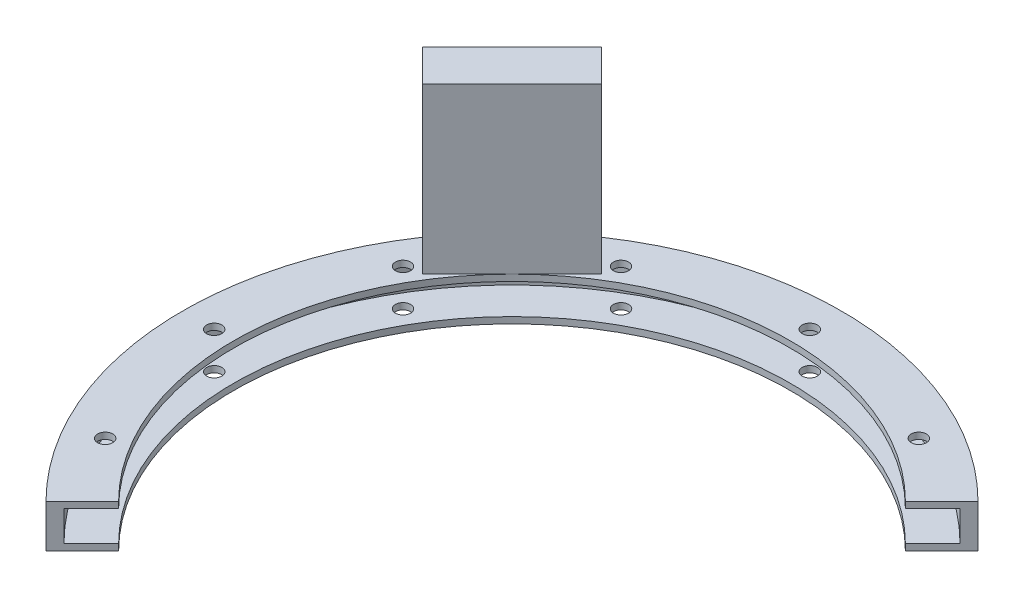
ISO-10303-21;
HEADER;
FILE_DESCRIPTION(('STEP AP214'),'2;1');
FILE_NAME('part.step','',(''),(''),'','','');
FILE_SCHEMA(('AUTOMOTIVE_DESIGN { 1 0 10303 214 1 1 1 1 }'));
ENDSEC;
DATA;
#1=APPLICATION_CONTEXT('core data for automotive mechanical design processes');
#2=APPLICATION_PROTOCOL_DEFINITION('international standard','automotive_design',2000,#1);
#3=PRODUCT_CONTEXT('',#1,'mechanical');
#4=PRODUCT('Part','Part','',(#3));
#5=PRODUCT_RELATED_PRODUCT_CATEGORY('part','',(#4));
#6=PRODUCT_DEFINITION_FORMATION('','',#4);
#7=PRODUCT_DEFINITION_CONTEXT('part definition',#1,'design');
#8=PRODUCT_DEFINITION('design','',#6,#7);
#9=PRODUCT_DEFINITION_SHAPE('','',#8);
#10=(LENGTH_UNIT() NAMED_UNIT(*) SI_UNIT(.MILLI.,.METRE.));
#11=(NAMED_UNIT(*) PLANE_ANGLE_UNIT() SI_UNIT($,.RADIAN.));
#12=(NAMED_UNIT(*) SI_UNIT($,.STERADIAN.) SOLID_ANGLE_UNIT());
#13=UNCERTAINTY_MEASURE_WITH_UNIT(LENGTH_MEASURE(1.E-05),#10,'distance_accuracy_value','');
#14=(GEOMETRIC_REPRESENTATION_CONTEXT(3) GLOBAL_UNCERTAINTY_ASSIGNED_CONTEXT((#13)) GLOBAL_UNIT_ASSIGNED_CONTEXT((#10,
#11,#12)) REPRESENTATION_CONTEXT('',''));
#15=CARTESIAN_POINT('',(0.,0.,0.));
#16=DIRECTION('',(0.,0.,1.));
#17=DIRECTION('',(1.,0.,0.));
#18=AXIS2_PLACEMENT_3D('',#15,#16,#17);
#19=CARTESIAN_POINT('',(0.,17.,0.));
#20=DIRECTION('',(0.,1.,0.));
#21=DIRECTION('',(0.,0.,1.));
#22=AXIS2_PLACEMENT_3D('',#19,#20,#21);
#23=PLANE('',#22);
#24=DIRECTION('',(-0.707106781186547,0.,-0.707106781186548));
#25=VECTOR('',#24,1.);
#26=CARTESIAN_POINT('',(-145.060846467359,17.,-215.771524586015));
#27=LINE('',#26,#25);
#28=CARTESIAN_POINT('',(-119.85459941112,17.,-190.565277529775));
#29=VERTEX_POINT('',#28);
#30=CARTESIAN_POINT('',(-145.060846467359,17.,-215.771524586015));
#31=VERTEX_POINT('',#30);
#32=EDGE_CURVE('E53',#29,#31,#27,.T.);
#33=ORIENTED_EDGE('',*,*,#32,.F.);
#34=DIRECTION('',(0.707106781186549,0.,-0.707106781186546));
#35=VECTOR('',#34,1.);
#36=CARTESIAN_POINT('',(-190.565277529774,17.,-119.85459941112));
#37=LINE('',#36,#35);
#38=CARTESIAN_POINT('',(-155.209938470447,17.,-155.209938470447));
#39=VERTEX_POINT('',#38);
#40=EDGE_CURVE('E11',#39,#29,#37,.T.);
#41=ORIENTED_EDGE('',*,*,#40,.F.);
#42=CARTESIAN_POINT('',(0.,17.,0.));
#43=DIRECTION('',(0.,1.,0.));
#44=DIRECTION('',(0.,0.,1.));
#45=AXIS2_PLACEMENT_3D('',#42,#43,#44);
#46=CIRCLE('',#45,219.5);
#47=CARTESIAN_POINT('',(155.209938470448,17.,-155.209938470446));
#48=VERTEX_POINT('',#47);
#49=EDGE_CURVE('E253',#48,#39,#46,.T.);
#50=ORIENTED_EDGE('',*,*,#49,.F.);
#51=DIRECTION('',(-0.707106781186551,0.,0.707106781186544));
#52=VECTOR('',#51,1.);
#53=CARTESIAN_POINT('',(-183.847763108503,17.,183.847763108501));
#54=LINE('',#53,#52);
#55=CARTESIAN_POINT('',(183.847763108503,17.,-183.847763108501));
#56=VERTEX_POINT('',#55);
#57=EDGE_CURVE('E155',#56,#48,#54,.T.);
#58=ORIENTED_EDGE('',*,*,#57,.F.);
#59=CARTESIAN_POINT('',(0.,17.,0.));
#60=DIRECTION('',(0.,1.,0.));
#61=DIRECTION('',(0.,0.,1.));
#62=AXIS2_PLACEMENT_3D('',#59,#60,#61);
#63=CIRCLE('',#62,260.);
#64=EDGE_CURVE('E257',#56,#31,#63,.T.);
#65=ORIENTED_EDGE('',*,*,#64,.T.);
#66=EDGE_LOOP('',(#33,#41,#50,#58,#65));
#67=FACE_BOUND('',#66,.T.);
#68=CARTESIAN_POINT('',(0.,17.,-235.));
#69=DIRECTION('',(0.,1.,0.));
#70=DIRECTION('',(0.,0.,1.));
#71=AXIS2_PLACEMENT_3D('',#68,#69,#70);
#72=CIRCLE('',#71,6.);
#73=CARTESIAN_POINT('',(0.,17.,-229.));
#74=VERTEX_POINT('',#73);
#75=EDGE_CURVE('E249',#74,#74,#72,.T.);
#76=ORIENTED_EDGE('',*,*,#75,.F.);
#77=EDGE_LOOP('',(#76));
#78=FACE_BOUND('',#77,.T.);
#79=CARTESIAN_POINT('',(117.500000000005,17.,-203.515969889363));
#80=DIRECTION('',(0.,1.,0.));
#81=DIRECTION('',(0.,0.,1.));
#82=AXIS2_PLACEMENT_3D('',#79,#80,#81);
#83=CIRCLE('',#82,5.9999999999995);
#84=CARTESIAN_POINT('',(117.500000000005,17.,-197.515969889364));
#85=VERTEX_POINT('',#84);
#86=EDGE_CURVE('E246',#85,#85,#83,.T.);
#87=ORIENTED_EDGE('',*,*,#86,.F.);
#88=EDGE_LOOP('',(#87));
#89=FACE_BOUND('',#88,.T.);
#90=CARTESIAN_POINT('',(-117.499999999995,17.,-203.515969889323));
#91=DIRECTION('',(0.,1.,0.));
#92=DIRECTION('',(0.,0.,1.));
#93=AXIS2_PLACEMENT_3D('',#90,#91,#92);
#94=CIRCLE('',#93,6.00000000001399);
#95=CARTESIAN_POINT('',(-117.499999999995,17.,-197.515969889309));
#96=VERTEX_POINT('',#95);
#97=EDGE_CURVE('E233',#96,#96,#94,.T.);
#98=ORIENTED_EDGE('',*,*,#97,.F.);
#99=EDGE_LOOP('',(#98));
#100=FACE_BOUND('',#99,.T.);
#101=ADVANCED_FACE('F35',(#67,#78,#89,#100),#23,.T.);
#102=DIRECTION('',(-0.707106781186549,0.,0.707106781186546));
#103=VECTOR('',#102,1.);
#104=CARTESIAN_POINT('',(-215.771524586014,17.,-145.06084646736));
#105=LINE('',#104,#103);
#106=CARTESIAN_POINT('',(-215.771524586014,17.,-145.06084646736));
#107=VERTEX_POINT('',#106);
#108=EDGE_CURVE('E151',#31,#107,#105,.T.);
#109=ORIENTED_EDGE('',*,*,#108,.F.);
#110=EDGE_CURVE('E259',#31,#107,#63,.T.);
#111=ORIENTED_EDGE('',*,*,#110,.T.);
#112=EDGE_LOOP('',(#109,#111));
#113=FACE_BOUND('',#112,.T.);
#114=ADVANCED_FACE('F308',(#113),#23,.T.);
#115=CARTESIAN_POINT('',(0.,17.,0.));
#116=DIRECTION('',(0.,-1.,0.));
#117=DIRECTION('',(0.,0.,-1.));
#118=AXIS2_PLACEMENT_3D('',#115,#116,#117);
#119=CYLINDRICAL_SURFACE('',#118,219.5);
#120=DIRECTION('',(0.,-1.,0.));
#121=VECTOR('',#120,1.);
#122=CARTESIAN_POINT('',(155.209938470448,17.,-155.209938470446));
#123=LINE('',#122,#121);
#124=CARTESIAN_POINT('',(155.209938470448,-12.,-155.209938470446));
#125=VERTEX_POINT('',#124);
#126=CARTESIAN_POINT('',(155.209938470448,-17.,-155.209938470446));
#127=VERTEX_POINT('',#126);
#128=EDGE_CURVE('E186',#125,#127,#123,.T.);
#129=ORIENTED_EDGE('',*,*,#128,.F.);
#130=CARTESIAN_POINT('',(0.,-12.,0.));
#131=DIRECTION('',(0.,1.,0.));
#132=DIRECTION('',(0.,0.,1.));
#133=AXIS2_PLACEMENT_3D('',#130,#131,#132);
#134=CIRCLE('',#133,219.5);
#135=CARTESIAN_POINT('',(-155.209938470448,-12.,155.209938470446));
#136=VERTEX_POINT('',#135);
#137=EDGE_CURVE('E229',#125,#136,#134,.T.);
#138=ORIENTED_EDGE('',*,*,#137,.T.);
#139=DIRECTION('',(0.,-1.,0.));
#140=VECTOR('',#139,1.);
#141=CARTESIAN_POINT('',(-155.209938470448,17.,155.209938470446));
#142=LINE('',#141,#140);
#143=CARTESIAN_POINT('',(-155.209938470448,-17.,155.209938470446));
#144=VERTEX_POINT('',#143);
#145=EDGE_CURVE('E178',#144,#136,#142,.F.);
#146=ORIENTED_EDGE('',*,*,#145,.F.);
#147=CARTESIAN_POINT('',(0.,-17.,0.));
#148=DIRECTION('',(0.,1.,0.));
#149=DIRECTION('',(0.,0.,1.));
#150=AXIS2_PLACEMENT_3D('',#147,#148,#149);
#151=CIRCLE('',#150,219.5);
#152=EDGE_CURVE('E277',#127,#144,#151,.T.);
#153=ORIENTED_EDGE('',*,*,#152,.F.);
#154=EDGE_LOOP('',(#129,#138,#146,#153));
#155=FACE_BOUND('',#154,.T.);
#156=ADVANCED_FACE('F314',(#155),#119,.F.);
#157=CARTESIAN_POINT('',(0.,17.,-235.));
#158=DIRECTION('',(0.,-1.,0.));
#159=DIRECTION('',(0.,0.,-1.));
#160=AXIS2_PLACEMENT_3D('',#157,#158,#159);
#161=CYLINDRICAL_SURFACE('',#160,6.);
#162=CARTESIAN_POINT('',(0.,-17.,-235.));
#163=DIRECTION('',(0.,1.,0.));
#164=DIRECTION('',(0.,0.,1.));
#165=AXIS2_PLACEMENT_3D('',#162,#163,#164);
#166=CIRCLE('',#165,6.);
#167=CARTESIAN_POINT('',(0.,-17.,-229.));
#168=VERTEX_POINT('',#167);
#169=EDGE_CURVE('E274',#168,#168,#166,.T.);
#170=ORIENTED_EDGE('',*,*,#169,.F.);
#171=EDGE_LOOP('',(#170));
#172=FACE_BOUND('',#171,.T.);
#173=CARTESIAN_POINT('',(0.,-12.,-235.));
#174=DIRECTION('',(0.,1.,0.));
#175=DIRECTION('',(0.,0.,1.));
#176=AXIS2_PLACEMENT_3D('',#173,#174,#175);
#177=CIRCLE('',#176,6.);
#178=CARTESIAN_POINT('',(0.,-12.,-229.));
#179=VERTEX_POINT('',#178);
#180=EDGE_CURVE('E226',#179,#179,#177,.T.);
#181=ORIENTED_EDGE('',*,*,#180,.T.);
#182=EDGE_LOOP('',(#181));
#183=FACE_BOUND('',#182,.T.);
#184=ADVANCED_FACE('F364',(#172,#183),#161,.F.);
#185=CARTESIAN_POINT('',(117.500000000005,17.,-203.515969889363));
#186=DIRECTION('',(0.,-1.,0.));
#187=DIRECTION('',(0.,0.,-1.));
#188=AXIS2_PLACEMENT_3D('',#185,#186,#187);
#189=CYLINDRICAL_SURFACE('',#188,5.9999999999995);
#190=CARTESIAN_POINT('',(117.500000000005,-17.,-203.515969889363));
#191=DIRECTION('',(0.,1.,0.));
#192=DIRECTION('',(0.,0.,1.));
#193=AXIS2_PLACEMENT_3D('',#190,#191,#192);
#194=CIRCLE('',#193,5.9999999999995);
#195=CARTESIAN_POINT('',(117.500000000005,-17.,-197.515969889364));
#196=VERTEX_POINT('',#195);
#197=EDGE_CURVE('E271',#196,#196,#194,.T.);
#198=ORIENTED_EDGE('',*,*,#197,.F.);
#199=EDGE_LOOP('',(#198));
#200=FACE_BOUND('',#199,.T.);
#201=CARTESIAN_POINT('',(117.500000000005,-12.,-203.515969889363));
#202=DIRECTION('',(0.,1.,0.));
#203=DIRECTION('',(0.,0.,1.));
#204=AXIS2_PLACEMENT_3D('',#201,#202,#203);
#205=CIRCLE('',#204,5.9999999999995);
#206=CARTESIAN_POINT('',(117.500000000005,-12.,-197.515969889364));
#207=VERTEX_POINT('',#206);
#208=EDGE_CURVE('E223',#207,#207,#205,.T.);
#209=ORIENTED_EDGE('',*,*,#208,.T.);
#210=EDGE_LOOP('',(#209));
#211=FACE_BOUND('',#210,.T.);
#212=ADVANCED_FACE('F354',(#200,#211),#189,.F.);
#213=CARTESIAN_POINT('',(-203.515969889283,17.,117.500000000035));
#214=DIRECTION('',(0.,-1.,0.));
#215=DIRECTION('',(0.,0.,-1.));
#216=AXIS2_PLACEMENT_3D('',#213,#214,#215);
#217=CYLINDRICAL_SURFACE('',#216,6.00000000006974);
#218=CARTESIAN_POINT('',(-203.515969889283,-17.,117.500000000035));
#219=DIRECTION('',(0.,1.,0.));
#220=DIRECTION('',(0.,0.,1.));
#221=AXIS2_PLACEMENT_3D('',#218,#219,#220);
#222=CIRCLE('',#221,6.00000000006974);
#223=CARTESIAN_POINT('',(-203.515969889283,-17.,123.500000000105));
#224=VERTEX_POINT('',#223);
#225=EDGE_CURVE('E268',#224,#224,#222,.T.);
#226=ORIENTED_EDGE('',*,*,#225,.F.);
#227=EDGE_LOOP('',(#226));
#228=FACE_BOUND('',#227,.T.);
#229=CARTESIAN_POINT('',(-203.515969889283,-12.,117.500000000035));
#230=DIRECTION('',(0.,1.,0.));
#231=DIRECTION('',(0.,0.,1.));
#232=AXIS2_PLACEMENT_3D('',#229,#230,#231);
#233=CIRCLE('',#232,6.00000000006974);
#234=CARTESIAN_POINT('',(-203.515969889283,-12.,123.500000000105));
#235=VERTEX_POINT('',#234);
#236=EDGE_CURVE('E220',#235,#235,#233,.T.);
#237=ORIENTED_EDGE('',*,*,#236,.T.);
#238=EDGE_LOOP('',(#237));
#239=FACE_BOUND('',#238,.T.);
#240=ADVANCED_FACE('F342',(#228,#239),#217,.F.);
#241=CARTESIAN_POINT('',(-234.99999999996,17.,4.00746102968696E-11));
#242=DIRECTION('',(0.,-1.,0.));
#243=DIRECTION('',(0.,0.,-1.));
#244=AXIS2_PLACEMENT_3D('',#241,#242,#243);
#245=CYLINDRICAL_SURFACE('',#244,6.00000000005239);
#246=CARTESIAN_POINT('',(-234.99999999996,-17.,4.00746102968696E-11));
#247=DIRECTION('',(0.,1.,0.));
#248=DIRECTION('',(0.,0.,1.));
#249=AXIS2_PLACEMENT_3D('',#246,#247,#248);
#250=CIRCLE('',#249,6.00000000005239);
#251=CARTESIAN_POINT('',(-234.99999999996,-17.,6.00000000009247));
#252=VERTEX_POINT('',#251);
#253=EDGE_CURVE('E265',#252,#252,#250,.T.);
#254=ORIENTED_EDGE('',*,*,#253,.F.);
#255=EDGE_LOOP('',(#254));
#256=FACE_BOUND('',#255,.T.);
#257=CARTESIAN_POINT('',(-234.99999999996,-12.,4.00746102968696E-11));
#258=DIRECTION('',(0.,1.,0.));
#259=DIRECTION('',(0.,0.,1.));
#260=AXIS2_PLACEMENT_3D('',#257,#258,#259);
#261=CIRCLE('',#260,6.00000000005239);
#262=CARTESIAN_POINT('',(-234.99999999996,-12.,6.00000000009247));
#263=VERTEX_POINT('',#262);
#264=EDGE_CURVE('E217',#263,#263,#261,.T.);
#265=ORIENTED_EDGE('',*,*,#264,.T.);
#266=EDGE_LOOP('',(#265));
#267=FACE_BOUND('',#266,.T.);
#268=ADVANCED_FACE('F350',(#256,#267),#245,.F.);
#269=CARTESIAN_POINT('',(-203.515969889323,17.,-117.499999999965));
#270=DIRECTION('',(0.,-1.,0.));
#271=DIRECTION('',(0.,0.,-1.));
#272=AXIS2_PLACEMENT_3D('',#269,#270,#271);
#273=CYLINDRICAL_SURFACE('',#272,6.00000000003206);
#274=CARTESIAN_POINT('',(-203.515969889323,-17.,-117.499999999965));
#275=DIRECTION('',(0.,1.,0.));
#276=DIRECTION('',(0.,0.,1.));
#277=AXIS2_PLACEMENT_3D('',#274,#275,#276);
#278=CIRCLE('',#277,6.00000000003206);
#279=CARTESIAN_POINT('',(-203.515969889323,-17.,-111.499999999933));
#280=VERTEX_POINT('',#279);
#281=EDGE_CURVE('E262',#280,#280,#278,.T.);
#282=ORIENTED_EDGE('',*,*,#281,.F.);
#283=EDGE_LOOP('',(#282));
#284=FACE_BOUND('',#283,.T.);
#285=CARTESIAN_POINT('',(-203.515969889323,-12.,-117.499999999965));
#286=DIRECTION('',(0.,1.,0.));
#287=DIRECTION('',(0.,0.,1.));
#288=AXIS2_PLACEMENT_3D('',#285,#286,#287);
#289=CIRCLE('',#288,6.00000000003206);
#290=CARTESIAN_POINT('',(-203.515969889323,-12.,-111.499999999933));
#291=VERTEX_POINT('',#290);
#292=EDGE_CURVE('E214',#291,#291,#289,.T.);
#293=ORIENTED_EDGE('',*,*,#292,.T.);
#294=EDGE_LOOP('',(#293));
#295=FACE_BOUND('',#294,.T.);
#296=ADVANCED_FACE('F362',(#284,#295),#273,.F.);
#297=CARTESIAN_POINT('',(-117.499999999995,17.,-203.515969889323));
#298=DIRECTION('',(0.,-1.,0.));
#299=DIRECTION('',(0.,0.,-1.));
#300=AXIS2_PLACEMENT_3D('',#297,#298,#299);
#301=CYLINDRICAL_SURFACE('',#300,6.00000000001399);
#302=CARTESIAN_POINT('',(-117.499999999995,-17.,-203.515969889323));
#303=DIRECTION('',(0.,1.,0.));
#304=DIRECTION('',(0.,0.,1.));
#305=AXIS2_PLACEMENT_3D('',#302,#303,#304);
#306=CIRCLE('',#305,6.00000000001399);
#307=CARTESIAN_POINT('',(-117.499999999995,-17.,-197.515969889309));
#308=VERTEX_POINT('',#307);
#309=EDGE_CURVE('E232',#308,#308,#306,.T.);
#310=ORIENTED_EDGE('',*,*,#309,.F.);
#311=EDGE_LOOP('',(#310));
#312=FACE_BOUND('',#311,.T.);
#313=CARTESIAN_POINT('',(-117.499999999995,-12.,-203.515969889323));
#314=DIRECTION('',(0.,1.,0.));
#315=DIRECTION('',(0.,0.,1.));
#316=AXIS2_PLACEMENT_3D('',#313,#314,#315);
#317=CIRCLE('',#316,6.00000000001399);
#318=CARTESIAN_POINT('',(-117.499999999995,-12.,-197.515969889309));
#319=VERTEX_POINT('',#318);
#320=EDGE_CURVE('E213',#319,#319,#317,.T.);
#321=ORIENTED_EDGE('',*,*,#320,.T.);
#322=EDGE_LOOP('',(#321));
#323=FACE_BOUND('',#322,.T.);
#324=ADVANCED_FACE('F286',(#312,#323),#301,.F.);
#325=DIRECTION('',(0.,-1.,0.));
#326=VECTOR('',#325,1.);
#327=CARTESIAN_POINT('',(155.209938470448,17.,-155.209938470446));
#328=LINE('',#327,#326);
#329=CARTESIAN_POINT('',(155.209938470448,12.,-155.209938470446));
#330=VERTEX_POINT('',#329);
#331=EDGE_CURVE('E184',#48,#330,#328,.T.);
#332=ORIENTED_EDGE('',*,*,#331,.F.);
#333=ORIENTED_EDGE('',*,*,#49,.T.);
#334=CARTESIAN_POINT('',(-155.209938470448,17.,155.209938470446));
#335=VERTEX_POINT('',#334);
#336=EDGE_CURVE('E252',#39,#335,#46,.T.);
#337=ORIENTED_EDGE('',*,*,#336,.T.);
#338=DIRECTION('',(0.,-1.,0.));
#339=VECTOR('',#338,1.);
#340=CARTESIAN_POINT('',(-155.209938470448,17.,155.209938470446));
#341=LINE('',#340,#339);
#342=CARTESIAN_POINT('',(-155.209938470448,12.,155.209938470446));
#343=VERTEX_POINT('',#342);
#344=EDGE_CURVE('E173',#343,#335,#341,.F.);
#345=ORIENTED_EDGE('',*,*,#344,.F.);
#346=CARTESIAN_POINT('',(0.,12.,0.));
#347=DIRECTION('',(0.,1.,0.));
#348=DIRECTION('',(0.,0.,1.));
#349=AXIS2_PLACEMENT_3D('',#346,#347,#348);
#350=CIRCLE('',#349,219.5);
#351=EDGE_CURVE('E210',#330,#343,#350,.T.);
#352=ORIENTED_EDGE('',*,*,#351,.F.);
#353=EDGE_LOOP('',(#332,#333,#337,#345,#352));
#354=FACE_BOUND('',#353,.T.);
#355=ADVANCED_FACE('F380',(#354),#119,.F.);
#356=CARTESIAN_POINT('',(0.,12.,-235.));
#357=DIRECTION('',(0.,1.,0.));
#358=DIRECTION('',(0.,0.,1.));
#359=AXIS2_PLACEMENT_3D('',#356,#357,#358);
#360=CIRCLE('',#359,6.);
#361=CARTESIAN_POINT('',(0.,12.,-229.));
#362=VERTEX_POINT('',#361);
#363=EDGE_CURVE('E207',#362,#362,#360,.T.);
#364=ORIENTED_EDGE('',*,*,#363,.F.);
#365=EDGE_LOOP('',(#364));
#366=FACE_BOUND('',#365,.T.);
#367=ORIENTED_EDGE('',*,*,#75,.T.);
#368=EDGE_LOOP('',(#367));
#369=FACE_BOUND('',#368,.T.);
#370=ADVANCED_FACE('F351',(#366,#369),#161,.F.);
#371=CARTESIAN_POINT('',(117.500000000005,12.,-203.515969889363));
#372=DIRECTION('',(0.,1.,0.));
#373=DIRECTION('',(0.,0.,1.));
#374=AXIS2_PLACEMENT_3D('',#371,#372,#373);
#375=CIRCLE('',#374,5.9999999999995);
#376=CARTESIAN_POINT('',(117.500000000005,12.,-197.515969889364));
#377=VERTEX_POINT('',#376);
#378=EDGE_CURVE('E204',#377,#377,#375,.T.);
#379=ORIENTED_EDGE('',*,*,#378,.F.);
#380=EDGE_LOOP('',(#379));
#381=FACE_BOUND('',#380,.T.);
#382=ORIENTED_EDGE('',*,*,#86,.T.);
#383=EDGE_LOOP('',(#382));
#384=FACE_BOUND('',#383,.T.);
#385=ADVANCED_FACE('F339',(#381,#384),#189,.F.);
#386=CARTESIAN_POINT('',(-203.515969889283,12.,117.500000000035));
#387=DIRECTION('',(0.,1.,0.));
#388=DIRECTION('',(0.,0.,1.));
#389=AXIS2_PLACEMENT_3D('',#386,#387,#388);
#390=CIRCLE('',#389,6.00000000006974);
#391=CARTESIAN_POINT('',(-203.515969889283,12.,123.500000000105));
#392=VERTEX_POINT('',#391);
#393=EDGE_CURVE('E201',#392,#392,#390,.T.);
#394=ORIENTED_EDGE('',*,*,#393,.F.);
#395=EDGE_LOOP('',(#394));
#396=FACE_BOUND('',#395,.T.);
#397=CARTESIAN_POINT('',(-203.515969889283,17.,117.500000000035));
#398=DIRECTION('',(0.,1.,0.));
#399=DIRECTION('',(0.,0.,1.));
#400=AXIS2_PLACEMENT_3D('',#397,#398,#399);
#401=CIRCLE('',#400,6.00000000006974);
#402=CARTESIAN_POINT('',(-203.515969889283,17.,123.500000000105));
#403=VERTEX_POINT('',#402);
#404=EDGE_CURVE('E243',#403,#403,#401,.T.);
#405=ORIENTED_EDGE('',*,*,#404,.T.);
#406=EDGE_LOOP('',(#405));
#407=FACE_BOUND('',#406,.T.);
#408=ADVANCED_FACE('F336',(#396,#407),#217,.F.);
#409=CARTESIAN_POINT('',(-234.99999999996,12.,4.00746102968696E-11));
#410=DIRECTION('',(0.,1.,0.));
#411=DIRECTION('',(0.,0.,1.));
#412=AXIS2_PLACEMENT_3D('',#409,#410,#411);
#413=CIRCLE('',#412,6.00000000005239);
#414=CARTESIAN_POINT('',(-234.99999999996,12.,6.00000000009247));
#415=VERTEX_POINT('',#414);
#416=EDGE_CURVE('E198',#415,#415,#413,.T.);
#417=ORIENTED_EDGE('',*,*,#416,.F.);
#418=EDGE_LOOP('',(#417));
#419=FACE_BOUND('',#418,.T.);
#420=CARTESIAN_POINT('',(-234.99999999996,17.,4.00746102968696E-11));
#421=DIRECTION('',(0.,1.,0.));
#422=DIRECTION('',(0.,0.,1.));
#423=AXIS2_PLACEMENT_3D('',#420,#421,#422);
#424=CIRCLE('',#423,6.00000000005239);
#425=CARTESIAN_POINT('',(-234.99999999996,17.,6.00000000009247));
#426=VERTEX_POINT('',#425);
#427=EDGE_CURVE('E240',#426,#426,#424,.T.);
#428=ORIENTED_EDGE('',*,*,#427,.T.);
#429=EDGE_LOOP('',(#428));
#430=FACE_BOUND('',#429,.T.);
#431=ADVANCED_FACE('F338',(#419,#430),#245,.F.);
#432=CARTESIAN_POINT('',(-203.515969889323,12.,-117.499999999965));
#433=DIRECTION('',(0.,1.,0.));
#434=DIRECTION('',(0.,0.,1.));
#435=AXIS2_PLACEMENT_3D('',#432,#433,#434);
#436=CIRCLE('',#435,6.00000000003206);
#437=CARTESIAN_POINT('',(-203.515969889323,12.,-111.499999999933));
#438=VERTEX_POINT('',#437);
#439=EDGE_CURVE('E195',#438,#438,#436,.T.);
#440=ORIENTED_EDGE('',*,*,#439,.F.);
#441=EDGE_LOOP('',(#440));
#442=FACE_BOUND('',#441,.T.);
#443=CARTESIAN_POINT('',(-203.515969889323,17.,-117.499999999965));
#444=DIRECTION('',(0.,1.,0.));
#445=DIRECTION('',(0.,0.,1.));
#446=AXIS2_PLACEMENT_3D('',#443,#444,#445);
#447=CIRCLE('',#446,6.00000000003206);
#448=CARTESIAN_POINT('',(-203.515969889323,17.,-111.499999999933));
#449=VERTEX_POINT('',#448);
#450=EDGE_CURVE('E236',#449,#449,#447,.T.);
#451=ORIENTED_EDGE('',*,*,#450,.T.);
#452=EDGE_LOOP('',(#451));
#453=FACE_BOUND('',#452,.T.);
#454=ADVANCED_FACE('F347',(#442,#453),#273,.F.);
#455=CARTESIAN_POINT('',(-117.499999999995,12.,-203.515969889323));
#456=DIRECTION('',(0.,1.,0.));
#457=DIRECTION('',(0.,0.,1.));
#458=AXIS2_PLACEMENT_3D('',#455,#456,#457);
#459=CIRCLE('',#458,6.00000000001399);
#460=CARTESIAN_POINT('',(-117.499999999995,12.,-197.515969889309));
#461=VERTEX_POINT('',#460);
#462=EDGE_CURVE('E192',#461,#461,#459,.T.);
#463=ORIENTED_EDGE('',*,*,#462,.F.);
#464=EDGE_LOOP('',(#463));
#465=FACE_BOUND('',#464,.T.);
#466=ORIENTED_EDGE('',*,*,#97,.T.);
#467=EDGE_LOOP('',(#466));
#468=FACE_BOUND('',#467,.T.);
#469=ADVANCED_FACE('F37',(#465,#468),#301,.F.);
#470=CARTESIAN_POINT('',(0.,17.,0.));
#471=DIRECTION('',(0.,-1.,0.));
#472=DIRECTION('',(0.,0.,-1.));
#473=AXIS2_PLACEMENT_3D('',#470,#471,#472);
#474=CYLINDRICAL_SURFACE('',#473,260.);
#475=CARTESIAN_POINT('',(0.,-17.,0.));
#476=DIRECTION('',(0.,1.,0.));
#477=DIRECTION('',(0.,0.,1.));
#478=AXIS2_PLACEMENT_3D('',#475,#476,#477);
#479=CIRCLE('',#478,260.);
#480=CARTESIAN_POINT('',(183.847763108503,-17.,-183.847763108501));
#481=VERTEX_POINT('',#480);
#482=CARTESIAN_POINT('',(-183.847763108503,-17.,183.847763108501));
#483=VERTEX_POINT('',#482);
#484=EDGE_CURVE('E237',#481,#483,#479,.T.);
#485=ORIENTED_EDGE('',*,*,#484,.T.);
#486=DIRECTION('',(0.,1.,0.));
#487=VECTOR('',#486,1.);
#488=CARTESIAN_POINT('',(-183.847763108503,-17.,183.847763108501));
#489=LINE('',#488,#487);
#490=CARTESIAN_POINT('',(-183.847763108503,17.,183.847763108501));
#491=VERTEX_POINT('',#490);
#492=EDGE_CURVE('E166',#483,#491,#489,.T.);
#493=ORIENTED_EDGE('',*,*,#492,.T.);
#494=EDGE_CURVE('E256',#107,#491,#63,.T.);
#495=ORIENTED_EDGE('',*,*,#494,.F.);
#496=ORIENTED_EDGE('',*,*,#110,.F.);
#497=ORIENTED_EDGE('',*,*,#64,.F.);
#498=DIRECTION('',(0.,1.,0.));
#499=VECTOR('',#498,1.);
#500=CARTESIAN_POINT('',(183.847763108503,-17.,-183.847763108501));
#501=LINE('',#500,#499);
#502=EDGE_CURVE('E163',#481,#56,#501,.T.);
#503=ORIENTED_EDGE('',*,*,#502,.F.);
#504=EDGE_LOOP('',(#485,#493,#495,#496,#497,#503));
#505=FACE_BOUND('',#504,.T.);
#506=ADVANCED_FACE('F319',(#505),#474,.T.);
#507=CARTESIAN_POINT('',(-190.565277529774,17.,-119.85459941112));
#508=VERTEX_POINT('',#507);
#509=EDGE_CURVE('E46',#508,#39,#37,.T.);
#510=ORIENTED_EDGE('',*,*,#509,.F.);
#511=DIRECTION('',(0.707106781186546,0.,0.707106781186549));
#512=VECTOR('',#511,1.);
#513=CARTESIAN_POINT('',(-215.771524586014,17.,-145.06084646736));
#514=LINE('',#513,#512);
#515=EDGE_CURVE('E491',#107,#508,#514,.T.);
#516=ORIENTED_EDGE('',*,*,#515,.F.);
#517=ORIENTED_EDGE('',*,*,#494,.T.);
#518=EDGE_CURVE('E152',#335,#491,#54,.T.);
#519=ORIENTED_EDGE('',*,*,#518,.F.);
#520=ORIENTED_EDGE('',*,*,#336,.F.);
#521=EDGE_LOOP('',(#510,#516,#517,#519,#520));
#522=FACE_BOUND('',#521,.T.);
#523=ORIENTED_EDGE('',*,*,#450,.F.);
#524=EDGE_LOOP('',(#523));
#525=FACE_BOUND('',#524,.T.);
#526=ORIENTED_EDGE('',*,*,#427,.F.);
#527=EDGE_LOOP('',(#526));
#528=FACE_BOUND('',#527,.T.);
#529=ORIENTED_EDGE('',*,*,#404,.F.);
#530=EDGE_LOOP('',(#529));
#531=FACE_BOUND('',#530,.T.);
#532=ADVANCED_FACE('F310',(#522,#525,#528,#531),#23,.T.);
#533=CARTESIAN_POINT('',(0.,-17.,0.));
#534=DIRECTION('',(0.,1.,0.));
#535=DIRECTION('',(0.,0.,1.));
#536=AXIS2_PLACEMENT_3D('',#533,#534,#535);
#537=PLANE('',#536);
#538=ORIENTED_EDGE('',*,*,#309,.T.);
#539=EDGE_LOOP('',(#538));
#540=FACE_BOUND('',#539,.T.);
#541=ORIENTED_EDGE('',*,*,#281,.T.);
#542=EDGE_LOOP('',(#541));
#543=FACE_BOUND('',#542,.T.);
#544=ORIENTED_EDGE('',*,*,#253,.T.);
#545=EDGE_LOOP('',(#544));
#546=FACE_BOUND('',#545,.T.);
#547=ORIENTED_EDGE('',*,*,#225,.T.);
#548=EDGE_LOOP('',(#547));
#549=FACE_BOUND('',#548,.T.);
#550=ORIENTED_EDGE('',*,*,#197,.T.);
#551=EDGE_LOOP('',(#550));
#552=FACE_BOUND('',#551,.T.);
#553=ORIENTED_EDGE('',*,*,#169,.T.);
#554=EDGE_LOOP('',(#553));
#555=FACE_BOUND('',#554,.T.);
#556=ORIENTED_EDGE('',*,*,#484,.F.);
#557=DIRECTION('',(-0.707106781186551,0.,0.707106781186544));
#558=VECTOR('',#557,1.);
#559=CARTESIAN_POINT('',(-183.847763108503,-17.,183.847763108501));
#560=LINE('',#559,#558);
#561=EDGE_CURVE('E161',#481,#127,#560,.T.);
#562=ORIENTED_EDGE('',*,*,#561,.T.);
#563=ORIENTED_EDGE('',*,*,#152,.T.);
#564=EDGE_CURVE('E164',#144,#483,#560,.T.);
#565=ORIENTED_EDGE('',*,*,#564,.T.);
#566=EDGE_LOOP('',(#556,#562,#563,#565));
#567=FACE_BOUND('',#566,.T.);
#568=ADVANCED_FACE('F301',(#540,#543,#546,#549,#552,#555,#567),#537,.F.);
#569=CARTESIAN_POINT('',(0.,-12.,0.));
#570=DIRECTION('',(0.,1.,0.));
#571=DIRECTION('',(0.,0.,1.));
#572=AXIS2_PLACEMENT_3D('',#569,#570,#571);
#573=CYLINDRICAL_SURFACE('',#572,250.);
#574=CARTESIAN_POINT('',(0.,12.,0.));
#575=DIRECTION('',(0.,1.,0.));
#576=DIRECTION('',(0.,0.,1.));
#577=AXIS2_PLACEMENT_3D('',#574,#575,#576);
#578=CIRCLE('',#577,250.);
#579=CARTESIAN_POINT('',(176.776695296638,12.,-176.776695296636));
#580=VERTEX_POINT('',#579);
#581=CARTESIAN_POINT('',(-176.776695296638,12.,176.776695296636));
#582=VERTEX_POINT('',#581);
#583=EDGE_CURVE('E188',#580,#582,#578,.T.);
#584=ORIENTED_EDGE('',*,*,#583,.T.);
#585=DIRECTION('',(0.,1.,0.));
#586=VECTOR('',#585,1.);
#587=CARTESIAN_POINT('',(-176.776695296638,-12.,176.776695296636));
#588=LINE('',#587,#586);
#589=CARTESIAN_POINT('',(-176.776695296638,-12.,176.776695296636));
#590=VERTEX_POINT('',#589);
#591=EDGE_CURVE('E169',#582,#590,#588,.F.);
#592=ORIENTED_EDGE('',*,*,#591,.T.);
#593=CARTESIAN_POINT('',(0.,-12.,0.));
#594=DIRECTION('',(0.,1.,0.));
#595=DIRECTION('',(0.,0.,1.));
#596=AXIS2_PLACEMENT_3D('',#593,#594,#595);
#597=CIRCLE('',#596,250.);
#598=CARTESIAN_POINT('',(176.776695296638,-12.,-176.776695296636));
#599=VERTEX_POINT('',#598);
#600=EDGE_CURVE('E189',#599,#590,#597,.T.);
#601=ORIENTED_EDGE('',*,*,#600,.F.);
#602=DIRECTION('',(0.,1.,0.));
#603=VECTOR('',#602,1.);
#604=CARTESIAN_POINT('',(176.776695296638,-12.,-176.776695296636));
#605=LINE('',#604,#603);
#606=EDGE_CURVE('E181',#599,#580,#605,.T.);
#607=ORIENTED_EDGE('',*,*,#606,.T.);
#608=EDGE_LOOP('',(#584,#592,#601,#607));
#609=FACE_BOUND('',#608,.T.);
#610=ADVANCED_FACE('F291',(#609),#573,.F.);
#611=CARTESIAN_POINT('',(0.,-12.,0.));
#612=DIRECTION('',(0.,1.,0.));
#613=DIRECTION('',(0.,0.,1.));
#614=AXIS2_PLACEMENT_3D('',#611,#612,#613);
#615=PLANE('',#614);
#616=DIRECTION('',(-0.707106781186551,0.,0.707106781186544));
#617=VECTOR('',#616,1.);
#618=CARTESIAN_POINT('',(0.,-12.,0.));
#619=LINE('',#618,#617);
#620=EDGE_CURVE('E179',#599,#125,#619,.T.);
#621=ORIENTED_EDGE('',*,*,#620,.F.);
#622=ORIENTED_EDGE('',*,*,#600,.T.);
#623=EDGE_CURVE('E176',#136,#590,#619,.T.);
#624=ORIENTED_EDGE('',*,*,#623,.F.);
#625=ORIENTED_EDGE('',*,*,#137,.F.);
#626=EDGE_LOOP('',(#621,#622,#624,#625));
#627=FACE_BOUND('',#626,.T.);
#628=ORIENTED_EDGE('',*,*,#180,.F.);
#629=EDGE_LOOP('',(#628));
#630=FACE_BOUND('',#629,.T.);
#631=ORIENTED_EDGE('',*,*,#208,.F.);
#632=EDGE_LOOP('',(#631));
#633=FACE_BOUND('',#632,.T.);
#634=ORIENTED_EDGE('',*,*,#236,.F.);
#635=EDGE_LOOP('',(#634));
#636=FACE_BOUND('',#635,.T.);
#637=ORIENTED_EDGE('',*,*,#264,.F.);
#638=EDGE_LOOP('',(#637));
#639=FACE_BOUND('',#638,.T.);
#640=ORIENTED_EDGE('',*,*,#292,.F.);
#641=EDGE_LOOP('',(#640));
#642=FACE_BOUND('',#641,.T.);
#643=ORIENTED_EDGE('',*,*,#320,.F.);
#644=EDGE_LOOP('',(#643));
#645=FACE_BOUND('',#644,.T.);
#646=ADVANCED_FACE('F288',(#627,#630,#633,#636,#639,#642,#645),#615,.T.);
#647=CARTESIAN_POINT('',(0.,12.,0.));
#648=DIRECTION('',(0.,1.,0.));
#649=DIRECTION('',(0.,0.,1.));
#650=AXIS2_PLACEMENT_3D('',#647,#648,#649);
#651=PLANE('',#650);
#652=ORIENTED_EDGE('',*,*,#583,.F.);
#653=DIRECTION('',(-0.707106781186551,0.,0.707106781186544));
#654=VECTOR('',#653,1.);
#655=CARTESIAN_POINT('',(0.,12.,0.));
#656=LINE('',#655,#654);
#657=EDGE_CURVE('E44',#580,#330,#656,.T.);
#658=ORIENTED_EDGE('',*,*,#657,.T.);
#659=ORIENTED_EDGE('',*,*,#351,.T.);
#660=EDGE_CURVE('E39',#343,#582,#656,.T.);
#661=ORIENTED_EDGE('',*,*,#660,.T.);
#662=EDGE_LOOP('',(#652,#658,#659,#661));
#663=FACE_BOUND('',#662,.T.);
#664=ORIENTED_EDGE('',*,*,#363,.T.);
#665=EDGE_LOOP('',(#664));
#666=FACE_BOUND('',#665,.T.);
#667=ORIENTED_EDGE('',*,*,#378,.T.);
#668=EDGE_LOOP('',(#667));
#669=FACE_BOUND('',#668,.T.);
#670=ORIENTED_EDGE('',*,*,#393,.T.);
#671=EDGE_LOOP('',(#670));
#672=FACE_BOUND('',#671,.T.);
#673=ORIENTED_EDGE('',*,*,#416,.T.);
#674=EDGE_LOOP('',(#673));
#675=FACE_BOUND('',#674,.T.);
#676=ORIENTED_EDGE('',*,*,#439,.T.);
#677=EDGE_LOOP('',(#676));
#678=FACE_BOUND('',#677,.T.);
#679=ORIENTED_EDGE('',*,*,#462,.T.);
#680=EDGE_LOOP('',(#679));
#681=FACE_BOUND('',#680,.T.);
#682=ADVANCED_FACE('F290',(#663,#666,#669,#672,#675,#678,#681),#651,.F.);
#683=CARTESIAN_POINT('',(-183.847763108503,-17.,183.847763108501));
#684=DIRECTION('',(-0.707106781186544,0.,-0.707106781186551));
#685=DIRECTION('',(-0.707106781186551,0.,0.707106781186544));
#686=AXIS2_PLACEMENT_3D('',#683,#684,#685);
#687=PLANE('',#686);
#688=ORIENTED_EDGE('',*,*,#145,.T.);
#689=ORIENTED_EDGE('',*,*,#623,.T.);
#690=ORIENTED_EDGE('',*,*,#591,.F.);
#691=ORIENTED_EDGE('',*,*,#660,.F.);
#692=ORIENTED_EDGE('',*,*,#344,.T.);
#693=ORIENTED_EDGE('',*,*,#518,.T.);
#694=ORIENTED_EDGE('',*,*,#492,.F.);
#695=ORIENTED_EDGE('',*,*,#564,.F.);
#696=EDGE_LOOP('',(#688,#689,#690,#691,#692,#693,#694,#695));
#697=FACE_BOUND('',#696,.T.);
#698=ADVANCED_FACE('F298',(#697),#687,.F.);
#699=ORIENTED_EDGE('',*,*,#128,.T.);
#700=ORIENTED_EDGE('',*,*,#561,.F.);
#701=ORIENTED_EDGE('',*,*,#502,.T.);
#702=ORIENTED_EDGE('',*,*,#57,.T.);
#703=ORIENTED_EDGE('',*,*,#331,.T.);
#704=ORIENTED_EDGE('',*,*,#657,.F.);
#705=ORIENTED_EDGE('',*,*,#606,.F.);
#706=ORIENTED_EDGE('',*,*,#620,.T.);
#707=EDGE_LOOP('',(#699,#700,#701,#702,#703,#704,#705,#706));
#708=FACE_BOUND('',#707,.T.);
#709=ADVANCED_FACE('F423',(#708),#687,.F.);
#710=CARTESIAN_POINT('',(-215.771524586014,147.,-145.06084646736));
#711=DIRECTION('',(0.707106781186546,0.,0.707106781186549));
#712=DIRECTION('',(0.707106781186549,0.,-0.707106781186546));
#713=AXIS2_PLACEMENT_3D('',#710,#711,#712);
#714=PLANE('',#713);
#715=ORIENTED_EDGE('',*,*,#108,.T.);
#716=DIRECTION('',(0.,-1.,0.));
#717=VECTOR('',#716,1.);
#718=CARTESIAN_POINT('',(-215.771524586014,147.,-145.06084646736));
#719=LINE('',#718,#717);
#720=CARTESIAN_POINT('',(-215.771524586014,147.,-145.06084646736));
#721=VERTEX_POINT('',#720);
#722=EDGE_CURVE('E133',#721,#107,#719,.T.);
#723=ORIENTED_EDGE('',*,*,#722,.F.);
#724=DIRECTION('',(-0.707106781186549,0.,0.707106781186546));
#725=VECTOR('',#724,1.);
#726=CARTESIAN_POINT('',(-215.771524586014,147.,-145.06084646736));
#727=LINE('',#726,#725);
#728=CARTESIAN_POINT('',(-145.060846467359,147.,-215.771524586015));
#729=VERTEX_POINT('',#728);
#730=EDGE_CURVE('E140',#729,#721,#727,.T.);
#731=ORIENTED_EDGE('',*,*,#730,.F.);
#732=DIRECTION('',(0.,-1.,0.));
#733=VECTOR('',#732,1.);
#734=CARTESIAN_POINT('',(-145.060846467359,147.,-215.771524586015));
#735=LINE('',#734,#733);
#736=EDGE_CURVE('E496',#729,#31,#735,.T.);
#737=ORIENTED_EDGE('',*,*,#736,.T.);
#738=EDGE_LOOP('',(#715,#723,#731,#737));
#739=FACE_BOUND('',#738,.T.);
#740=ADVANCED_FACE('F150',(#739),#714,.F.);
#741=CARTESIAN_POINT('',(-215.771524586014,147.,-145.06084646736));
#742=DIRECTION('',(0.707106781186549,0.,-0.707106781186546));
#743=DIRECTION('',(-0.707106781186546,0.,-0.707106781186549));
#744=AXIS2_PLACEMENT_3D('',#741,#742,#743);
#745=PLANE('',#744);
#746=ORIENTED_EDGE('',*,*,#515,.T.);
#747=DIRECTION('',(0.,-1.,0.));
#748=VECTOR('',#747,1.);
#749=CARTESIAN_POINT('',(-190.565277529774,147.,-119.85459941112));
#750=LINE('',#749,#748);
#751=CARTESIAN_POINT('',(-190.565277529774,147.,-119.85459941112));
#752=VERTEX_POINT('',#751);
#753=EDGE_CURVE('E136',#752,#508,#750,.T.);
#754=ORIENTED_EDGE('',*,*,#753,.F.);
#755=DIRECTION('',(0.707106781186546,0.,0.707106781186549));
#756=VECTOR('',#755,1.);
#757=CARTESIAN_POINT('',(-215.771524586014,147.,-145.06084646736));
#758=LINE('',#757,#756);
#759=EDGE_CURVE('E128',#721,#752,#758,.T.);
#760=ORIENTED_EDGE('',*,*,#759,.F.);
#761=ORIENTED_EDGE('',*,*,#722,.T.);
#762=EDGE_LOOP('',(#746,#754,#760,#761));
#763=FACE_BOUND('',#762,.T.);
#764=ADVANCED_FACE('F131',(#763),#745,.F.);
#765=CARTESIAN_POINT('',(-190.565277529774,147.,-119.85459941112));
#766=DIRECTION('',(-0.707106781186546,0.,-0.707106781186549));
#767=DIRECTION('',(-0.707106781186549,0.,0.707106781186546));
#768=AXIS2_PLACEMENT_3D('',#765,#766,#767);
#769=PLANE('',#768);
#770=ORIENTED_EDGE('',*,*,#509,.T.);
#771=ORIENTED_EDGE('',*,*,#40,.T.);
#772=DIRECTION('',(0.,-1.,0.));
#773=VECTOR('',#772,1.);
#774=CARTESIAN_POINT('',(-119.85459941112,147.,-190.565277529775));
#775=LINE('',#774,#773);
#776=CARTESIAN_POINT('',(-119.85459941112,147.,-190.565277529775));
#777=VERTEX_POINT('',#776);
#778=EDGE_CURVE('E157',#777,#29,#775,.T.);
#779=ORIENTED_EDGE('',*,*,#778,.F.);
#780=DIRECTION('',(0.707106781186549,0.,-0.707106781186546));
#781=VECTOR('',#780,1.);
#782=CARTESIAN_POINT('',(-190.565277529774,147.,-119.85459941112));
#783=LINE('',#782,#781);
#784=EDGE_CURVE('E139',#752,#777,#783,.T.);
#785=ORIENTED_EDGE('',*,*,#784,.F.);
#786=ORIENTED_EDGE('',*,*,#753,.T.);
#787=EDGE_LOOP('',(#770,#771,#779,#785,#786));
#788=FACE_BOUND('',#787,.T.);
#789=ADVANCED_FACE('F434',(#788),#769,.F.);
#790=CARTESIAN_POINT('',(-145.060846467359,147.,-215.771524586015));
#791=DIRECTION('',(-0.707106781186548,0.,0.707106781186547));
#792=DIRECTION('',(0.707106781186547,0.,0.707106781186548));
#793=AXIS2_PLACEMENT_3D('',#790,#791,#792);
#794=PLANE('',#793);
#795=ORIENTED_EDGE('',*,*,#32,.T.);
#796=ORIENTED_EDGE('',*,*,#736,.F.);
#797=DIRECTION('',(-0.707106781186547,0.,-0.707106781186548));
#798=VECTOR('',#797,1.);
#799=CARTESIAN_POINT('',(-145.060846467359,147.,-215.771524586015));
#800=LINE('',#799,#798);
#801=EDGE_CURVE('E145',#777,#729,#800,.T.);
#802=ORIENTED_EDGE('',*,*,#801,.F.);
#803=ORIENTED_EDGE('',*,*,#778,.T.);
#804=EDGE_LOOP('',(#795,#796,#802,#803));
#805=FACE_BOUND('',#804,.T.);
#806=ADVANCED_FACE('F443',(#805),#794,.F.);
#807=CARTESIAN_POINT('',(0.,147.,0.));
#808=DIRECTION('',(0.,-1.,0.));
#809=DIRECTION('',(0.,0.,-1.));
#810=AXIS2_PLACEMENT_3D('',#807,#808,#809);
#811=PLANE('',#810);
#812=ORIENTED_EDGE('',*,*,#730,.T.);
#813=ORIENTED_EDGE('',*,*,#759,.T.);
#814=ORIENTED_EDGE('',*,*,#784,.T.);
#815=ORIENTED_EDGE('',*,*,#801,.T.);
#816=EDGE_LOOP('',(#812,#813,#814,#815));
#817=FACE_BOUND('',#816,.T.);
#818=ADVANCED_FACE('F143',(#817),#811,.F.);
#819=CLOSED_SHELL('',(#101,#114,#156,#184,#212,#240,#268,#296,#324,#355,#370,#385,#408,#431,
#454,#469,#506,#532,#568,#610,#646,#682,#698,#709,#740,#764,#789,#806,#818));
#820=MANIFOLD_SOLID_BREP('B2',#819);
#821=ADVANCED_BREP_SHAPE_REPRESENTATION('',(#18,#820),#14);
#822=SHAPE_DEFINITION_REPRESENTATION(#9,#821);
ENDSEC;
END-ISO-10303-21;
